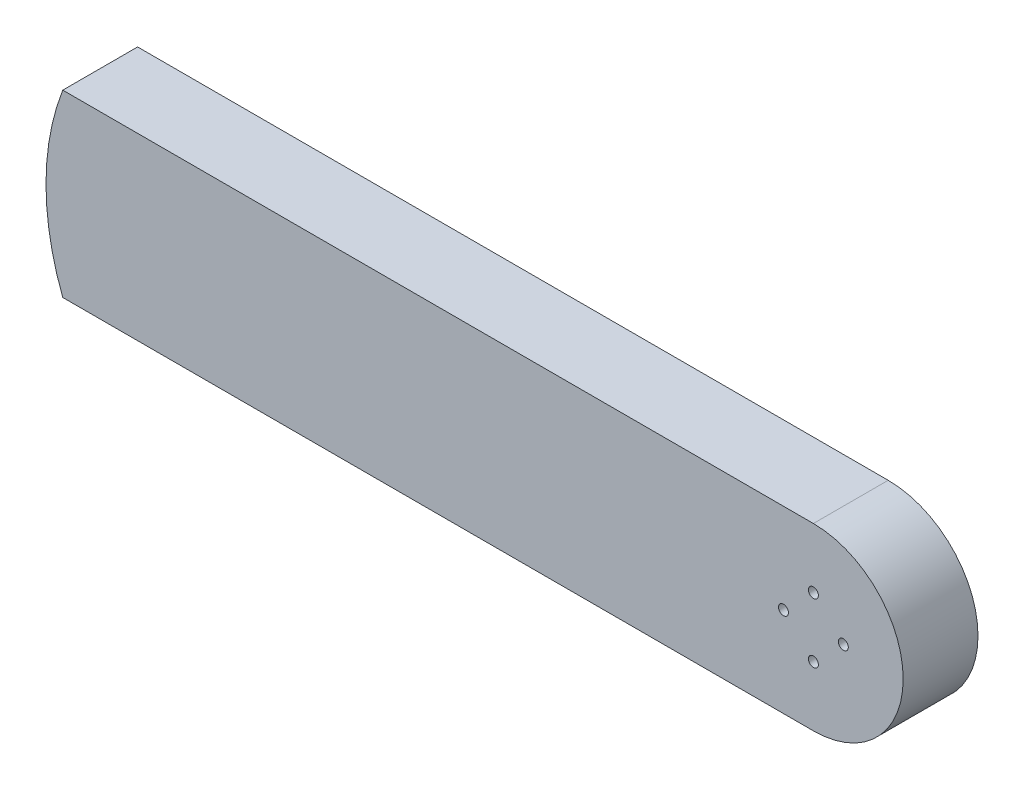
ISO-10303-21;
HEADER;
FILE_DESCRIPTION(('STEP AP214'),'2;1');
FILE_NAME('part.step','',(''),(''),'','','');
FILE_SCHEMA(('AUTOMOTIVE_DESIGN { 1 0 10303 214 1 1 1 1 }'));
ENDSEC;
DATA;
#1=APPLICATION_CONTEXT('core data for automotive mechanical design processes');
#2=APPLICATION_PROTOCOL_DEFINITION('international standard','automotive_design',2000,#1);
#3=PRODUCT_CONTEXT('',#1,'mechanical');
#4=PRODUCT('Part','Part','',(#3));
#5=PRODUCT_RELATED_PRODUCT_CATEGORY('part','',(#4));
#6=PRODUCT_DEFINITION_FORMATION('','',#4);
#7=PRODUCT_DEFINITION_CONTEXT('part definition',#1,'design');
#8=PRODUCT_DEFINITION('design','',#6,#7);
#9=PRODUCT_DEFINITION_SHAPE('','',#8);
#10=(LENGTH_UNIT() NAMED_UNIT(*) SI_UNIT(.MILLI.,.METRE.));
#11=(NAMED_UNIT(*) PLANE_ANGLE_UNIT() SI_UNIT($,.RADIAN.));
#12=(NAMED_UNIT(*) SI_UNIT($,.STERADIAN.) SOLID_ANGLE_UNIT());
#13=UNCERTAINTY_MEASURE_WITH_UNIT(LENGTH_MEASURE(1.E-05),#10,'distance_accuracy_value','');
#14=(GEOMETRIC_REPRESENTATION_CONTEXT(3) GLOBAL_UNCERTAINTY_ASSIGNED_CONTEXT((#13)) GLOBAL_UNIT_ASSIGNED_CONTEXT((#10,
#11,#12)) REPRESENTATION_CONTEXT('',''));
#15=CARTESIAN_POINT('',(0.,0.,0.));
#16=DIRECTION('',(0.,0.,1.));
#17=DIRECTION('',(1.,0.,0.));
#18=AXIS2_PLACEMENT_3D('',#15,#16,#17);
#19=CARTESIAN_POINT('',(0.,0.,15.));
#20=DIRECTION('',(0.,0.,-1.));
#21=DIRECTION('',(-1.,0.,0.));
#22=AXIS2_PLACEMENT_3D('',#19,#20,#21);
#23=PLANE('',#22);
#24=CARTESIAN_POINT('',(153.829678241047,12.,15.));
#25=DIRECTION('',(0.,0.,-1.));
#26=DIRECTION('',(-1.,0.,0.));
#27=AXIS2_PLACEMENT_3D('',#24,#25,#26);
#28=CIRCLE('',#27,0.999999999999998);
#29=CARTESIAN_POINT('',(152.829678241047,12.,15.));
#30=VERTEX_POINT('',#29);
#31=EDGE_CURVE('E298',#30,#30,#28,.T.);
#32=ORIENTED_EDGE('',*,*,#31,.T.);
#33=EDGE_LOOP('',(#32));
#34=FACE_BOUND('',#33,.T.);
#35=CARTESIAN_POINT('',(159.829678241047,18.,15.));
#36=DIRECTION('',(0.,0.,-1.));
#37=DIRECTION('',(-1.,0.,0.));
#38=AXIS2_PLACEMENT_3D('',#35,#36,#37);
#39=CIRCLE('',#38,0.999999999999998);
#40=CARTESIAN_POINT('',(158.829678241047,18.,15.));
#41=VERTEX_POINT('',#40);
#42=EDGE_CURVE('E316',#41,#41,#39,.T.);
#43=ORIENTED_EDGE('',*,*,#42,.T.);
#44=EDGE_LOOP('',(#43));
#45=FACE_BOUND('',#44,.T.);
#46=CARTESIAN_POINT('',(153.829678241047,24.,15.));
#47=DIRECTION('',(0.,0.,-1.));
#48=DIRECTION('',(-1.,0.,0.));
#49=AXIS2_PLACEMENT_3D('',#46,#47,#48);
#50=CIRCLE('',#49,0.999999999999998);
#51=CARTESIAN_POINT('',(152.829678241047,24.,15.));
#52=VERTEX_POINT('',#51);
#53=EDGE_CURVE('E324',#52,#52,#50,.T.);
#54=ORIENTED_EDGE('',*,*,#53,.T.);
#55=EDGE_LOOP('',(#54));
#56=FACE_BOUND('',#55,.T.);
#57=CARTESIAN_POINT('',(147.829678241047,18.,15.));
#58=DIRECTION('',(0.,0.,-1.));
#59=DIRECTION('',(-1.,0.,0.));
#60=AXIS2_PLACEMENT_3D('',#57,#58,#59);
#61=CIRCLE('',#60,0.999999999999998);
#62=CARTESIAN_POINT('',(146.829678241047,18.,15.));
#63=VERTEX_POINT('',#62);
#64=EDGE_CURVE('E303',#63,#63,#61,.T.);
#65=ORIENTED_EDGE('',*,*,#64,.T.);
#66=EDGE_LOOP('',(#65));
#67=FACE_BOUND('',#66,.T.);
#68=CARTESIAN_POINT('',(49.87,18.,15.));
#69=DIRECTION('',(0.,0.,-1.));
#70=DIRECTION('',(-1.,0.,0.));
#71=AXIS2_PLACEMENT_3D('',#68,#69,#70);
#72=CIRCLE('',#71,49.87);
#73=CARTESIAN_POINT('',(3.3617544944985,36.,15.));
#74=VERTEX_POINT('',#73);
#75=CARTESIAN_POINT('',(3.36175449449851,0.,15.));
#76=VERTEX_POINT('',#75);
#77=EDGE_CURVE('E145',#74,#76,#72,.F.);
#78=ORIENTED_EDGE('',*,*,#77,.T.);
#79=DIRECTION('',(1.,0.,0.));
#80=VECTOR('',#79,1.);
#81=CARTESIAN_POINT('',(0.,0.,15.));
#82=LINE('',#81,#80);
#83=CARTESIAN_POINT('',(153.829678241047,0.,15.));
#84=VERTEX_POINT('',#83);
#85=EDGE_CURVE('E72',#76,#84,#82,.T.);
#86=ORIENTED_EDGE('',*,*,#85,.T.);
#87=CARTESIAN_POINT('',(153.829678241047,18.,15.));
#88=DIRECTION('',(0.,0.,1.));
#89=DIRECTION('',(1.,0.,0.));
#90=AXIS2_PLACEMENT_3D('',#87,#88,#89);
#91=CIRCLE('',#90,18.);
#92=CARTESIAN_POINT('',(153.829678241047,36.,15.));
#93=VERTEX_POINT('',#92);
#94=EDGE_CURVE('E294',#84,#93,#91,.T.);
#95=ORIENTED_EDGE('',*,*,#94,.T.);
#96=DIRECTION('',(-1.,0.,0.));
#97=VECTOR('',#96,1.);
#98=CARTESIAN_POINT('',(0.,36.,15.));
#99=LINE('',#98,#97);
#100=EDGE_CURVE('E12',#93,#74,#99,.T.);
#101=ORIENTED_EDGE('',*,*,#100,.T.);
#102=EDGE_LOOP('',(#78,#86,#95,#101));
#103=FACE_BOUND('',#102,.T.);
#104=ADVANCED_FACE('F62',(#34,#45,#56,#67,#103),#23,.F.);
#105=CARTESIAN_POINT('',(0.,0.,0.));
#106=DIRECTION('',(0.,0.,-1.));
#107=DIRECTION('',(-1.,0.,0.));
#108=AXIS2_PLACEMENT_3D('',#105,#106,#107);
#109=PLANE('',#108);
#110=DIRECTION('',(0.,1.,0.));
#111=VECTOR('',#110,1.);
#112=CARTESIAN_POINT('',(145.169424203202,0.,0.));
#113=LINE('',#112,#111);
#114=CARTESIAN_POINT('',(145.169424203202,13.,0.));
#115=VERTEX_POINT('',#114);
#116=CARTESIAN_POINT('',(145.169424203202,23.,0.));
#117=VERTEX_POINT('',#116);
#118=EDGE_CURVE('E90',#115,#117,#113,.T.);
#119=ORIENTED_EDGE('',*,*,#118,.F.);
#120=DIRECTION('',(-0.866025403784439,0.5,0.));
#121=VECTOR('',#120,1.);
#122=CARTESIAN_POINT('',(41.9215211753995,72.6102046063664,0.));
#123=LINE('',#122,#121);
#124=CARTESIAN_POINT('',(153.829678241047,7.99999999999995,0.));
#125=VERTEX_POINT('',#124);
#126=EDGE_CURVE('E215',#125,#115,#123,.T.);
#127=ORIENTED_EDGE('',*,*,#126,.F.);
#128=DIRECTION('',(-0.866025403784439,-0.5,0.));
#129=VECTOR('',#128,1.);
#130=CARTESIAN_POINT('',(34.9933179451239,-60.6102046063664,0.));
#131=LINE('',#130,#129);
#132=CARTESIAN_POINT('',(162.489932278891,13.,0.));
#133=VERTEX_POINT('',#132);
#134=EDGE_CURVE('E244',#133,#125,#131,.T.);
#135=ORIENTED_EDGE('',*,*,#134,.F.);
#136=DIRECTION('',(0.,-1.,0.));
#137=VECTOR('',#136,1.);
#138=CARTESIAN_POINT('',(162.489932278891,0.,0.));
#139=LINE('',#138,#137);
#140=CARTESIAN_POINT('',(162.489932278891,23.,0.));
#141=VERTEX_POINT('',#140);
#142=EDGE_CURVE('E243',#141,#133,#139,.T.);
#143=ORIENTED_EDGE('',*,*,#142,.F.);
#144=DIRECTION('',(0.866025403784438,-0.5,0.));
#145=VECTOR('',#144,1.);
#146=CARTESIAN_POINT('',(50.5817752132439,87.6102046063665,0.));
#147=LINE('',#146,#145);
#148=CARTESIAN_POINT('',(153.829678241047,28.,0.));
#149=VERTEX_POINT('',#148);
#150=EDGE_CURVE('E241',#149,#141,#147,.T.);
#151=ORIENTED_EDGE('',*,*,#150,.F.);
#152=DIRECTION('',(0.866025403784439,0.499999999999999,0.));
#153=VECTOR('',#152,1.);
#154=CARTESIAN_POINT('',(26.3330639072794,-45.6102046063663,0.));
#155=LINE('',#154,#153);
#156=EDGE_CURVE('E238',#117,#149,#155,.T.);
#157=ORIENTED_EDGE('',*,*,#156,.F.);
#158=EDGE_LOOP('',(#119,#127,#135,#143,#151,#157));
#159=FACE_BOUND('',#158,.T.);
#160=CARTESIAN_POINT('',(7.,18.,0.));
#161=DIRECTION('',(0.,0.,1.));
#162=DIRECTION('',(1.,0.,0.));
#163=AXIS2_PLACEMENT_3D('',#160,#161,#162);
#164=CIRCLE('',#163,0.999999999999983);
#165=CARTESIAN_POINT('',(7.99999999999998,18.,0.));
#166=VERTEX_POINT('',#165);
#167=EDGE_CURVE('E165',#166,#166,#164,.F.);
#168=ORIENTED_EDGE('',*,*,#167,.F.);
#169=EDGE_LOOP('',(#168));
#170=FACE_BOUND('',#169,.T.);
#171=CARTESIAN_POINT('',(90.7214002208002,5.,0.));
#172=DIRECTION('',(0.,0.,-1.));
#173=DIRECTION('',(-1.,0.,0.));
#174=AXIS2_PLACEMENT_3D('',#171,#172,#173);
#175=CIRCLE('',#174,0.999999999999998);
#176=CARTESIAN_POINT('',(89.7214002208002,5.,0.));
#177=VERTEX_POINT('',#176);
#178=EDGE_CURVE('E185',#177,#177,#175,.T.);
#179=ORIENTED_EDGE('',*,*,#178,.F.);
#180=EDGE_LOOP('',(#179));
#181=FACE_BOUND('',#180,.T.);
#182=CARTESIAN_POINT('',(9.01859977919973,31.,0.));
#183=DIRECTION('',(0.,0.,-1.));
#184=DIRECTION('',(-1.,0.,0.));
#185=AXIS2_PLACEMENT_3D('',#182,#183,#184);
#186=CIRCLE('',#185,0.999999999999998);
#187=CARTESIAN_POINT('',(8.01859977919974,31.,0.));
#188=VERTEX_POINT('',#187);
#189=EDGE_CURVE('E174',#188,#188,#186,.T.);
#190=ORIENTED_EDGE('',*,*,#189,.F.);
#191=EDGE_LOOP('',(#190));
#192=FACE_BOUND('',#191,.T.);
#193=CARTESIAN_POINT('',(9.01859977919973,5.00000000000001,0.));
#194=DIRECTION('',(0.,0.,1.));
#195=DIRECTION('',(1.,0.,0.));
#196=AXIS2_PLACEMENT_3D('',#193,#194,#195);
#197=CIRCLE('',#196,0.999999999999998);
#198=CARTESIAN_POINT('',(10.0185997791997,5.00000000000001,0.));
#199=VERTEX_POINT('',#198);
#200=EDGE_CURVE('E193',#199,#199,#197,.F.);
#201=ORIENTED_EDGE('',*,*,#200,.F.);
#202=EDGE_LOOP('',(#201));
#203=FACE_BOUND('',#202,.T.);
#204=CARTESIAN_POINT('',(90.7214002208003,31.,0.));
#205=DIRECTION('',(0.,0.,1.));
#206=DIRECTION('',(1.,0.,0.));
#207=AXIS2_PLACEMENT_3D('',#204,#205,#206);
#208=CIRCLE('',#207,0.999999999999998);
#209=CARTESIAN_POINT('',(91.7214002208003,31.,0.));
#210=VERTEX_POINT('',#209);
#211=EDGE_CURVE('E169',#210,#210,#208,.F.);
#212=ORIENTED_EDGE('',*,*,#211,.F.);
#213=EDGE_LOOP('',(#212));
#214=FACE_BOUND('',#213,.T.);
#215=CARTESIAN_POINT('',(92.74,18.,0.));
#216=DIRECTION('',(0.,0.,-1.));
#217=DIRECTION('',(-1.,0.,0.));
#218=AXIS2_PLACEMENT_3D('',#215,#216,#217);
#219=CIRCLE('',#218,0.999999999999998);
#220=CARTESIAN_POINT('',(91.74,18.,0.));
#221=VERTEX_POINT('',#220);
#222=EDGE_CURVE('E189',#221,#221,#219,.T.);
#223=ORIENTED_EDGE('',*,*,#222,.F.);
#224=EDGE_LOOP('',(#223));
#225=FACE_BOUND('',#224,.T.);
#226=DIRECTION('',(1.,0.,0.));
#227=VECTOR('',#226,1.);
#228=CARTESIAN_POINT('',(0.,0.,0.));
#229=LINE('',#228,#227);
#230=CARTESIAN_POINT('',(3.36175449449851,0.,0.));
#231=VERTEX_POINT('',#230);
#232=CARTESIAN_POINT('',(153.829678241047,0.,0.));
#233=VERTEX_POINT('',#232);
#234=EDGE_CURVE('E78',#231,#233,#229,.T.);
#235=ORIENTED_EDGE('',*,*,#234,.F.);
#236=CARTESIAN_POINT('',(49.87,18.,0.));
#237=DIRECTION('',(0.,0.,-1.));
#238=DIRECTION('',(-1.,0.,0.));
#239=AXIS2_PLACEMENT_3D('',#236,#237,#238);
#240=CIRCLE('',#239,49.87);
#241=CARTESIAN_POINT('',(3.3617544944985,36.,0.));
#242=VERTEX_POINT('',#241);
#243=EDGE_CURVE('E149',#231,#242,#240,.T.);
#244=ORIENTED_EDGE('',*,*,#243,.T.);
#245=DIRECTION('',(-1.,0.,0.));
#246=VECTOR('',#245,1.);
#247=CARTESIAN_POINT('',(0.,36.,0.));
#248=LINE('',#247,#246);
#249=CARTESIAN_POINT('',(153.829678241047,36.,0.));
#250=VERTEX_POINT('',#249);
#251=EDGE_CURVE('E66',#250,#242,#248,.T.);
#252=ORIENTED_EDGE('',*,*,#251,.F.);
#253=CARTESIAN_POINT('',(153.829678241047,18.,0.));
#254=DIRECTION('',(0.,0.,-1.));
#255=DIRECTION('',(-1.,0.,0.));
#256=AXIS2_PLACEMENT_3D('',#253,#254,#255);
#257=CIRCLE('',#256,18.);
#258=EDGE_CURVE('E292',#233,#250,#257,.F.);
#259=ORIENTED_EDGE('',*,*,#258,.F.);
#260=EDGE_LOOP('',(#235,#244,#252,#259));
#261=FACE_BOUND('',#260,.T.);
#262=ADVANCED_FACE('F273',(#159,#170,#181,#192,#203,#214,#225,#261),#109,.T.);
#263=CARTESIAN_POINT('',(0.,0.,15.));
#264=DIRECTION('',(0.,1.,0.));
#265=DIRECTION('',(0.,0.,1.));
#266=AXIS2_PLACEMENT_3D('',#263,#264,#265);
#267=PLANE('',#266);
#268=DIRECTION('',(0.,0.,-1.));
#269=VECTOR('',#268,1.);
#270=CARTESIAN_POINT('',(3.36175449449851,0.,15.001));
#271=LINE('',#270,#269);
#272=EDGE_CURVE('E154',#76,#231,#271,.T.);
#273=ORIENTED_EDGE('',*,*,#272,.T.);
#274=ORIENTED_EDGE('',*,*,#234,.T.);
#275=DIRECTION('',(0.,0.,1.));
#276=VECTOR('',#275,1.);
#277=CARTESIAN_POINT('',(153.829678241047,0.,-0.000999999999999265));
#278=LINE('',#277,#276);
#279=EDGE_CURVE('E156',#233,#84,#278,.T.);
#280=ORIENTED_EDGE('',*,*,#279,.T.);
#281=ORIENTED_EDGE('',*,*,#85,.F.);
#282=EDGE_LOOP('',(#273,#274,#280,#281));
#283=FACE_BOUND('',#282,.T.);
#284=ADVANCED_FACE('F64',(#283),#267,.F.);
#285=CARTESIAN_POINT('',(0.,36.,15.));
#286=DIRECTION('',(0.,-1.,0.));
#287=DIRECTION('',(0.,0.,-1.));
#288=AXIS2_PLACEMENT_3D('',#285,#286,#287);
#289=PLANE('',#288);
#290=DIRECTION('',(0.,0.,-1.));
#291=VECTOR('',#290,1.);
#292=CARTESIAN_POINT('',(3.3617544944985,36.,15.001));
#293=LINE('',#292,#291);
#294=EDGE_CURVE('E308',#74,#242,#293,.T.);
#295=ORIENTED_EDGE('',*,*,#294,.F.);
#296=ORIENTED_EDGE('',*,*,#100,.F.);
#297=DIRECTION('',(0.,0.,1.));
#298=VECTOR('',#297,1.);
#299=CARTESIAN_POINT('',(153.829678241047,36.,-0.000999999999999265));
#300=LINE('',#299,#298);
#301=EDGE_CURVE('E237',#250,#93,#300,.T.);
#302=ORIENTED_EDGE('',*,*,#301,.F.);
#303=ORIENTED_EDGE('',*,*,#251,.T.);
#304=EDGE_LOOP('',(#295,#296,#302,#303));
#305=FACE_BOUND('',#304,.T.);
#306=ADVANCED_FACE('F310',(#305),#289,.F.);
#307=CARTESIAN_POINT('',(92.74,18.,5.));
#308=DIRECTION('',(0.,0.,-1.));
#309=DIRECTION('',(-1.,0.,0.));
#310=AXIS2_PLACEMENT_3D('',#307,#308,#309);
#311=CYLINDRICAL_SURFACE('',#310,0.999999999999998);
#312=CARTESIAN_POINT('',(92.74,18.,5.));
#313=DIRECTION('',(0.,0.,-1.));
#314=DIRECTION('',(-1.,0.,0.));
#315=AXIS2_PLACEMENT_3D('',#312,#313,#314);
#316=CIRCLE('',#315,0.999999999999998);
#317=CARTESIAN_POINT('',(91.74,18.,5.));
#318=VERTEX_POINT('',#317);
#319=EDGE_CURVE('E160',#318,#318,#316,.T.);
#320=ORIENTED_EDGE('',*,*,#319,.F.);
#321=EDGE_LOOP('',(#320));
#322=FACE_BOUND('',#321,.T.);
#323=ORIENTED_EDGE('',*,*,#222,.T.);
#324=EDGE_LOOP('',(#323));
#325=FACE_BOUND('',#324,.T.);
#326=ADVANCED_FACE('F358',(#322,#325),#311,.F.);
#327=CARTESIAN_POINT('',(92.74,18.,5.));
#328=DIRECTION('',(0.,0.,-1.));
#329=DIRECTION('',(-1.,0.,0.));
#330=AXIS2_PLACEMENT_3D('',#327,#328,#329);
#331=PLANE('',#330);
#332=ORIENTED_EDGE('',*,*,#319,.T.);
#333=EDGE_LOOP('',(#332));
#334=FACE_BOUND('',#333,.T.);
#335=ADVANCED_FACE('F354',(#334),#331,.T.);
#336=CARTESIAN_POINT('',(90.7214002208003,31.,5.));
#337=DIRECTION('',(0.,0.,-1.));
#338=DIRECTION('',(-1.,0.,0.));
#339=AXIS2_PLACEMENT_3D('',#336,#337,#338);
#340=CYLINDRICAL_SURFACE('',#339,0.999999999999998);
#341=CARTESIAN_POINT('',(90.7214002208003,31.,5.));
#342=DIRECTION('',(0.,0.,1.));
#343=DIRECTION('',(1.,0.,0.));
#344=AXIS2_PLACEMENT_3D('',#341,#342,#343);
#345=CIRCLE('',#344,0.999999999999998);
#346=CARTESIAN_POINT('',(91.7214002208003,31.,5.));
#347=VERTEX_POINT('',#346);
#348=EDGE_CURVE('E191',#347,#347,#345,.F.);
#349=ORIENTED_EDGE('',*,*,#348,.F.);
#350=EDGE_LOOP('',(#349));
#351=FACE_BOUND('',#350,.T.);
#352=ORIENTED_EDGE('',*,*,#211,.T.);
#353=EDGE_LOOP('',(#352));
#354=FACE_BOUND('',#353,.T.);
#355=ADVANCED_FACE('F556',(#351,#354),#340,.F.);
#356=CARTESIAN_POINT('',(0.,0.,5.));
#357=DIRECTION('',(0.,0.,1.));
#358=DIRECTION('',(1.,0.,0.));
#359=AXIS2_PLACEMENT_3D('',#356,#357,#358);
#360=PLANE('',#359);
#361=ORIENTED_EDGE('',*,*,#348,.T.);
#362=EDGE_LOOP('',(#361));
#363=FACE_BOUND('',#362,.T.);
#364=ADVANCED_FACE('F548',(#363),#360,.F.);
#365=CARTESIAN_POINT('',(9.01859977919973,5.00000000000001,5.));
#366=DIRECTION('',(0.,0.,-1.));
#367=DIRECTION('',(-1.,0.,0.));
#368=AXIS2_PLACEMENT_3D('',#365,#366,#367);
#369=CYLINDRICAL_SURFACE('',#368,0.999999999999998);
#370=CARTESIAN_POINT('',(9.01859977919973,5.00000000000001,5.));
#371=DIRECTION('',(0.,0.,1.));
#372=DIRECTION('',(1.,0.,0.));
#373=AXIS2_PLACEMENT_3D('',#370,#371,#372);
#374=CIRCLE('',#373,0.999999999999998);
#375=CARTESIAN_POINT('',(10.0185997791997,5.00000000000001,5.));
#376=VERTEX_POINT('',#375);
#377=EDGE_CURVE('E178',#376,#376,#374,.F.);
#378=ORIENTED_EDGE('',*,*,#377,.F.);
#379=EDGE_LOOP('',(#378));
#380=FACE_BOUND('',#379,.T.);
#381=ORIENTED_EDGE('',*,*,#200,.T.);
#382=EDGE_LOOP('',(#381));
#383=FACE_BOUND('',#382,.T.);
#384=ADVANCED_FACE('F539',(#380,#383),#369,.F.);
#385=CARTESIAN_POINT('',(0.,0.,5.));
#386=DIRECTION('',(0.,0.,1.));
#387=DIRECTION('',(1.,0.,0.));
#388=AXIS2_PLACEMENT_3D('',#385,#386,#387);
#389=PLANE('',#388);
#390=ORIENTED_EDGE('',*,*,#377,.T.);
#391=EDGE_LOOP('',(#390));
#392=FACE_BOUND('',#391,.T.);
#393=ADVANCED_FACE('F530',(#392),#389,.F.);
#394=CARTESIAN_POINT('',(9.01859977919973,31.,5.));
#395=DIRECTION('',(0.,0.,-1.));
#396=DIRECTION('',(-1.,0.,0.));
#397=AXIS2_PLACEMENT_3D('',#394,#395,#396);
#398=CYLINDRICAL_SURFACE('',#397,0.999999999999998);
#399=CARTESIAN_POINT('',(9.01859977919973,31.,5.));
#400=DIRECTION('',(0.,0.,-1.));
#401=DIRECTION('',(-1.,0.,0.));
#402=AXIS2_PLACEMENT_3D('',#399,#400,#401);
#403=CIRCLE('',#402,0.999999999999998);
#404=CARTESIAN_POINT('',(8.01859977919974,31.,5.));
#405=VERTEX_POINT('',#404);
#406=EDGE_CURVE('E177',#405,#405,#403,.T.);
#407=ORIENTED_EDGE('',*,*,#406,.F.);
#408=EDGE_LOOP('',(#407));
#409=FACE_BOUND('',#408,.T.);
#410=ORIENTED_EDGE('',*,*,#189,.T.);
#411=EDGE_LOOP('',(#410));
#412=FACE_BOUND('',#411,.T.);
#413=ADVANCED_FACE('F524',(#409,#412),#398,.F.);
#414=CARTESIAN_POINT('',(9.01859977919973,31.,5.));
#415=DIRECTION('',(0.,0.,-1.));
#416=DIRECTION('',(-1.,0.,0.));
#417=AXIS2_PLACEMENT_3D('',#414,#415,#416);
#418=PLANE('',#417);
#419=ORIENTED_EDGE('',*,*,#406,.T.);
#420=EDGE_LOOP('',(#419));
#421=FACE_BOUND('',#420,.T.);
#422=ADVANCED_FACE('F515',(#421),#418,.T.);
#423=CARTESIAN_POINT('',(90.7214002208002,5.,5.));
#424=DIRECTION('',(0.,0.,-1.));
#425=DIRECTION('',(-1.,0.,0.));
#426=AXIS2_PLACEMENT_3D('',#423,#424,#425);
#427=CYLINDRICAL_SURFACE('',#426,0.999999999999998);
#428=CARTESIAN_POINT('',(90.7214002208002,5.,5.));
#429=DIRECTION('',(0.,0.,-1.));
#430=DIRECTION('',(-1.,0.,0.));
#431=AXIS2_PLACEMENT_3D('',#428,#429,#430);
#432=CIRCLE('',#431,0.999999999999998);
#433=CARTESIAN_POINT('',(89.7214002208002,5.,5.));
#434=VERTEX_POINT('',#433);
#435=EDGE_CURVE('E184',#434,#434,#432,.T.);
#436=ORIENTED_EDGE('',*,*,#435,.F.);
#437=EDGE_LOOP('',(#436));
#438=FACE_BOUND('',#437,.T.);
#439=ORIENTED_EDGE('',*,*,#178,.T.);
#440=EDGE_LOOP('',(#439));
#441=FACE_BOUND('',#440,.T.);
#442=ADVANCED_FACE('F503',(#438,#441),#427,.F.);
#443=CARTESIAN_POINT('',(90.7214002208002,5.,5.));
#444=DIRECTION('',(0.,0.,-1.));
#445=DIRECTION('',(-1.,0.,0.));
#446=AXIS2_PLACEMENT_3D('',#443,#444,#445);
#447=PLANE('',#446);
#448=ORIENTED_EDGE('',*,*,#435,.T.);
#449=EDGE_LOOP('',(#448));
#450=FACE_BOUND('',#449,.T.);
#451=ADVANCED_FACE('F494',(#450),#447,.T.);
#452=CARTESIAN_POINT('',(7.,18.,5.));
#453=DIRECTION('',(0.,0.,-1.));
#454=DIRECTION('',(-1.,0.,0.));
#455=AXIS2_PLACEMENT_3D('',#452,#453,#454);
#456=CYLINDRICAL_SURFACE('',#455,0.999999999999983);
#457=CARTESIAN_POINT('',(7.,18.,5.));
#458=DIRECTION('',(0.,0.,1.));
#459=DIRECTION('',(1.,0.,0.));
#460=AXIS2_PLACEMENT_3D('',#457,#458,#459);
#461=CIRCLE('',#460,0.999999999999983);
#462=CARTESIAN_POINT('',(7.99999999999998,18.,5.));
#463=VERTEX_POINT('',#462);
#464=EDGE_CURVE('E162',#463,#463,#461,.F.);
#465=ORIENTED_EDGE('',*,*,#464,.F.);
#466=EDGE_LOOP('',(#465));
#467=FACE_BOUND('',#466,.T.);
#468=ORIENTED_EDGE('',*,*,#167,.T.);
#469=EDGE_LOOP('',(#468));
#470=FACE_BOUND('',#469,.T.);
#471=ADVANCED_FACE('F488',(#467,#470),#456,.F.);
#472=CARTESIAN_POINT('',(0.,0.,5.));
#473=DIRECTION('',(0.,0.,1.));
#474=DIRECTION('',(1.,0.,0.));
#475=AXIS2_PLACEMENT_3D('',#472,#473,#474);
#476=PLANE('',#475);
#477=ORIENTED_EDGE('',*,*,#464,.T.);
#478=EDGE_LOOP('',(#477));
#479=FACE_BOUND('',#478,.T.);
#480=ADVANCED_FACE('F480',(#479),#476,.F.);
#481=CARTESIAN_POINT('',(145.169424203202,0.,10.));
#482=DIRECTION('',(-1.,0.,0.));
#483=DIRECTION('',(0.,0.,1.));
#484=AXIS2_PLACEMENT_3D('',#481,#482,#483);
#485=PLANE('',#484);
#486=ORIENTED_EDGE('',*,*,#118,.T.);
#487=DIRECTION('',(0.,0.,-1.));
#488=VECTOR('',#487,1.);
#489=CARTESIAN_POINT('',(145.169424203202,23.,10.));
#490=LINE('',#489,#488);
#491=CARTESIAN_POINT('',(145.169424203202,23.,10.));
#492=VERTEX_POINT('',#491);
#493=EDGE_CURVE('E175',#492,#117,#490,.T.);
#494=ORIENTED_EDGE('',*,*,#493,.F.);
#495=DIRECTION('',(0.,1.,0.));
#496=VECTOR('',#495,1.);
#497=CARTESIAN_POINT('',(145.169424203202,0.,10.));
#498=LINE('',#497,#496);
#499=CARTESIAN_POINT('',(145.169424203202,13.,10.));
#500=VERTEX_POINT('',#499);
#501=EDGE_CURVE('E249',#500,#492,#498,.T.);
#502=ORIENTED_EDGE('',*,*,#501,.F.);
#503=DIRECTION('',(0.,0.,-1.));
#504=VECTOR('',#503,1.);
#505=CARTESIAN_POINT('',(145.169424203202,13.,10.));
#506=LINE('',#505,#504);
#507=EDGE_CURVE('E202',#500,#115,#506,.T.);
#508=ORIENTED_EDGE('',*,*,#507,.T.);
#509=EDGE_LOOP('',(#486,#494,#502,#508));
#510=FACE_BOUND('',#509,.T.);
#511=ADVANCED_FACE('F270',(#510),#485,.F.);
#512=CARTESIAN_POINT('',(41.9215211753995,72.6102046063664,10.));
#513=DIRECTION('',(-0.5,-0.866025403784438,0.));
#514=DIRECTION('',(0.866025403784438,-0.5,0.));
#515=AXIS2_PLACEMENT_3D('',#512,#513,#514);
#516=PLANE('',#515);
#517=ORIENTED_EDGE('',*,*,#126,.T.);
#518=ORIENTED_EDGE('',*,*,#507,.F.);
#519=DIRECTION('',(-0.866025403784439,0.5,0.));
#520=VECTOR('',#519,1.);
#521=CARTESIAN_POINT('',(41.9215211753995,72.6102046063664,10.));
#522=LINE('',#521,#520);
#523=CARTESIAN_POINT('',(153.829678241047,7.99999999999995,10.));
#524=VERTEX_POINT('',#523);
#525=EDGE_CURVE('E222',#524,#500,#522,.T.);
#526=ORIENTED_EDGE('',*,*,#525,.F.);
#527=DIRECTION('',(0.,0.,-1.));
#528=VECTOR('',#527,1.);
#529=CARTESIAN_POINT('',(153.829678241047,7.99999999999995,10.));
#530=LINE('',#529,#528);
#531=EDGE_CURVE('E205',#524,#125,#530,.T.);
#532=ORIENTED_EDGE('',*,*,#531,.T.);
#533=EDGE_LOOP('',(#517,#518,#526,#532));
#534=FACE_BOUND('',#533,.T.);
#535=ADVANCED_FACE('F268',(#534),#516,.F.);
#536=CARTESIAN_POINT('',(34.9933179451239,-60.6102046063664,10.));
#537=DIRECTION('',(0.5,-0.866025403784439,0.));
#538=DIRECTION('',(0.866025403784439,0.5,0.));
#539=AXIS2_PLACEMENT_3D('',#536,#537,#538);
#540=PLANE('',#539);
#541=ORIENTED_EDGE('',*,*,#134,.T.);
#542=ORIENTED_EDGE('',*,*,#531,.F.);
#543=DIRECTION('',(-0.866025403784439,-0.5,0.));
#544=VECTOR('',#543,1.);
#545=CARTESIAN_POINT('',(34.9933179451239,-60.6102046063664,10.));
#546=LINE('',#545,#544);
#547=CARTESIAN_POINT('',(162.489932278891,13.,10.));
#548=VERTEX_POINT('',#547);
#549=EDGE_CURVE('E227',#548,#524,#546,.T.);
#550=ORIENTED_EDGE('',*,*,#549,.F.);
#551=DIRECTION('',(0.,0.,-1.));
#552=VECTOR('',#551,1.);
#553=CARTESIAN_POINT('',(162.489932278891,13.,10.));
#554=LINE('',#553,#552);
#555=EDGE_CURVE('E209',#548,#133,#554,.T.);
#556=ORIENTED_EDGE('',*,*,#555,.T.);
#557=EDGE_LOOP('',(#541,#542,#550,#556));
#558=FACE_BOUND('',#557,.T.);
#559=ADVANCED_FACE('F269',(#558),#540,.F.);
#560=CARTESIAN_POINT('',(162.489932278891,0.,10.));
#561=DIRECTION('',(1.,0.,0.));
#562=DIRECTION('',(0.,0.,-1.));
#563=AXIS2_PLACEMENT_3D('',#560,#561,#562);
#564=PLANE('',#563);
#565=ORIENTED_EDGE('',*,*,#142,.T.);
#566=ORIENTED_EDGE('',*,*,#555,.F.);
#567=DIRECTION('',(0.,-1.,0.));
#568=VECTOR('',#567,1.);
#569=CARTESIAN_POINT('',(162.489932278891,0.,10.));
#570=LINE('',#569,#568);
#571=CARTESIAN_POINT('',(162.489932278891,23.,10.));
#572=VERTEX_POINT('',#571);
#573=EDGE_CURVE('E231',#572,#548,#570,.T.);
#574=ORIENTED_EDGE('',*,*,#573,.F.);
#575=DIRECTION('',(0.,0.,-1.));
#576=VECTOR('',#575,1.);
#577=CARTESIAN_POINT('',(162.489932278891,23.,10.));
#578=LINE('',#577,#576);
#579=EDGE_CURVE('E219',#572,#141,#578,.T.);
#580=ORIENTED_EDGE('',*,*,#579,.T.);
#581=EDGE_LOOP('',(#565,#566,#574,#580));
#582=FACE_BOUND('',#581,.T.);
#583=ADVANCED_FACE('F266',(#582),#564,.F.);
#584=CARTESIAN_POINT('',(50.5817752132439,87.6102046063665,10.));
#585=DIRECTION('',(0.5,0.866025403784438,0.));
#586=DIRECTION('',(-0.866025403784438,0.5,0.));
#587=AXIS2_PLACEMENT_3D('',#584,#585,#586);
#588=PLANE('',#587);
#589=ORIENTED_EDGE('',*,*,#150,.T.);
#590=ORIENTED_EDGE('',*,*,#579,.F.);
#591=DIRECTION('',(0.866025403784438,-0.5,0.));
#592=VECTOR('',#591,1.);
#593=CARTESIAN_POINT('',(50.5817752132439,87.6102046063665,10.));
#594=LINE('',#593,#592);
#595=CARTESIAN_POINT('',(153.829678241047,28.,10.));
#596=VERTEX_POINT('',#595);
#597=EDGE_CURVE('E253',#596,#572,#594,.T.);
#598=ORIENTED_EDGE('',*,*,#597,.F.);
#599=DIRECTION('',(0.,0.,-1.));
#600=VECTOR('',#599,1.);
#601=CARTESIAN_POINT('',(153.829678241047,28.,10.));
#602=LINE('',#601,#600);
#603=EDGE_CURVE('E216',#596,#149,#602,.T.);
#604=ORIENTED_EDGE('',*,*,#603,.T.);
#605=EDGE_LOOP('',(#589,#590,#598,#604));
#606=FACE_BOUND('',#605,.T.);
#607=ADVANCED_FACE('F271',(#606),#588,.F.);
#608=CARTESIAN_POINT('',(26.3330639072794,-45.6102046063663,10.));
#609=DIRECTION('',(-0.499999999999999,0.866025403784439,0.));
#610=DIRECTION('',(-0.866025403784439,-0.499999999999999,0.));
#611=AXIS2_PLACEMENT_3D('',#608,#609,#610);
#612=PLANE('',#611);
#613=ORIENTED_EDGE('',*,*,#156,.T.);
#614=ORIENTED_EDGE('',*,*,#603,.F.);
#615=DIRECTION('',(0.866025403784439,0.499999999999999,0.));
#616=VECTOR('',#615,1.);
#617=CARTESIAN_POINT('',(26.3330639072794,-45.6102046063663,10.));
#618=LINE('',#617,#616);
#619=EDGE_CURVE('E255',#492,#596,#618,.T.);
#620=ORIENTED_EDGE('',*,*,#619,.F.);
#621=ORIENTED_EDGE('',*,*,#493,.T.);
#622=EDGE_LOOP('',(#613,#614,#620,#621));
#623=FACE_BOUND('',#622,.T.);
#624=ADVANCED_FACE('F272',(#623),#612,.F.);
#625=CARTESIAN_POINT('',(0.,0.,10.));
#626=DIRECTION('',(0.,0.,-1.));
#627=DIRECTION('',(-1.,0.,0.));
#628=AXIS2_PLACEMENT_3D('',#625,#626,#627);
#629=PLANE('',#628);
#630=CARTESIAN_POINT('',(153.829678241047,12.,10.));
#631=DIRECTION('',(0.,0.,-1.));
#632=DIRECTION('',(-1.,0.,0.));
#633=AXIS2_PLACEMENT_3D('',#630,#631,#632);
#634=CIRCLE('',#633,0.999999999999998);
#635=CARTESIAN_POINT('',(152.829678241047,12.,10.));
#636=VERTEX_POINT('',#635);
#637=EDGE_CURVE('E297',#636,#636,#634,.T.);
#638=ORIENTED_EDGE('',*,*,#637,.F.);
#639=EDGE_LOOP('',(#638));
#640=FACE_BOUND('',#639,.T.);
#641=CARTESIAN_POINT('',(159.829678241047,18.,10.));
#642=DIRECTION('',(0.,0.,-1.));
#643=DIRECTION('',(-1.,0.,0.));
#644=AXIS2_PLACEMENT_3D('',#641,#642,#643);
#645=CIRCLE('',#644,0.999999999999998);
#646=CARTESIAN_POINT('',(158.829678241047,18.,10.));
#647=VERTEX_POINT('',#646);
#648=EDGE_CURVE('E317',#647,#647,#645,.T.);
#649=ORIENTED_EDGE('',*,*,#648,.F.);
#650=EDGE_LOOP('',(#649));
#651=FACE_BOUND('',#650,.T.);
#652=CARTESIAN_POINT('',(153.829678241047,24.,10.));
#653=DIRECTION('',(0.,0.,-1.));
#654=DIRECTION('',(-1.,0.,0.));
#655=AXIS2_PLACEMENT_3D('',#652,#653,#654);
#656=CIRCLE('',#655,0.999999999999998);
#657=CARTESIAN_POINT('',(152.829678241047,24.,10.));
#658=VERTEX_POINT('',#657);
#659=EDGE_CURVE('E325',#658,#658,#656,.T.);
#660=ORIENTED_EDGE('',*,*,#659,.F.);
#661=EDGE_LOOP('',(#660));
#662=FACE_BOUND('',#661,.T.);
#663=CARTESIAN_POINT('',(147.829678241047,18.,10.));
#664=DIRECTION('',(0.,0.,-1.));
#665=DIRECTION('',(-1.,0.,0.));
#666=AXIS2_PLACEMENT_3D('',#663,#664,#665);
#667=CIRCLE('',#666,0.999999999999998);
#668=CARTESIAN_POINT('',(146.829678241047,18.,10.));
#669=VERTEX_POINT('',#668);
#670=EDGE_CURVE('E311',#669,#669,#667,.T.);
#671=ORIENTED_EDGE('',*,*,#670,.F.);
#672=EDGE_LOOP('',(#671));
#673=FACE_BOUND('',#672,.T.);
#674=ORIENTED_EDGE('',*,*,#501,.T.);
#675=ORIENTED_EDGE('',*,*,#619,.T.);
#676=ORIENTED_EDGE('',*,*,#597,.T.);
#677=ORIENTED_EDGE('',*,*,#573,.T.);
#678=ORIENTED_EDGE('',*,*,#549,.T.);
#679=ORIENTED_EDGE('',*,*,#525,.T.);
#680=EDGE_LOOP('',(#674,#675,#676,#677,#678,#679));
#681=FACE_BOUND('',#680,.T.);
#682=ADVANCED_FACE('F265',(#640,#651,#662,#673,#681),#629,.T.);
#683=CARTESIAN_POINT('',(153.829678241047,18.,-0.000999999999999265));
#684=DIRECTION('',(0.,0.,1.));
#685=DIRECTION('',(1.,0.,0.));
#686=AXIS2_PLACEMENT_3D('',#683,#684,#685);
#687=CYLINDRICAL_SURFACE('',#686,18.);
#688=ORIENTED_EDGE('',*,*,#258,.T.);
#689=ORIENTED_EDGE('',*,*,#301,.T.);
#690=ORIENTED_EDGE('',*,*,#94,.F.);
#691=ORIENTED_EDGE('',*,*,#279,.F.);
#692=EDGE_LOOP('',(#688,#689,#690,#691));
#693=FACE_BOUND('',#692,.T.);
#694=ADVANCED_FACE('F304',(#693),#687,.T.);
#695=CARTESIAN_POINT('',(147.829678241047,18.,15.));
#696=DIRECTION('',(0.,0.,-1.));
#697=DIRECTION('',(-1.,0.,0.));
#698=AXIS2_PLACEMENT_3D('',#695,#696,#697);
#699=CYLINDRICAL_SURFACE('',#698,0.999999999999998);
#700=ORIENTED_EDGE('',*,*,#64,.F.);
#701=EDGE_LOOP('',(#700));
#702=FACE_BOUND('',#701,.T.);
#703=ORIENTED_EDGE('',*,*,#670,.T.);
#704=EDGE_LOOP('',(#703));
#705=FACE_BOUND('',#704,.T.);
#706=ADVANCED_FACE('F327',(#702,#705),#699,.F.);
#707=CARTESIAN_POINT('',(153.829678241047,24.,15.));
#708=DIRECTION('',(0.,0.,-1.));
#709=DIRECTION('',(-1.,0.,0.));
#710=AXIS2_PLACEMENT_3D('',#707,#708,#709);
#711=CYLINDRICAL_SURFACE('',#710,0.999999999999998);
#712=ORIENTED_EDGE('',*,*,#53,.F.);
#713=EDGE_LOOP('',(#712));
#714=FACE_BOUND('',#713,.T.);
#715=ORIENTED_EDGE('',*,*,#659,.T.);
#716=EDGE_LOOP('',(#715));
#717=FACE_BOUND('',#716,.T.);
#718=ADVANCED_FACE('F392',(#714,#717),#711,.F.);
#719=CARTESIAN_POINT('',(159.829678241047,18.,15.));
#720=DIRECTION('',(0.,0.,-1.));
#721=DIRECTION('',(-1.,0.,0.));
#722=AXIS2_PLACEMENT_3D('',#719,#720,#721);
#723=CYLINDRICAL_SURFACE('',#722,0.999999999999998);
#724=ORIENTED_EDGE('',*,*,#42,.F.);
#725=EDGE_LOOP('',(#724));
#726=FACE_BOUND('',#725,.T.);
#727=ORIENTED_EDGE('',*,*,#648,.T.);
#728=EDGE_LOOP('',(#727));
#729=FACE_BOUND('',#728,.T.);
#730=ADVANCED_FACE('F388',(#726,#729),#723,.F.);
#731=CARTESIAN_POINT('',(153.829678241047,12.,15.));
#732=DIRECTION('',(0.,0.,-1.));
#733=DIRECTION('',(-1.,0.,0.));
#734=AXIS2_PLACEMENT_3D('',#731,#732,#733);
#735=CYLINDRICAL_SURFACE('',#734,0.999999999999998);
#736=ORIENTED_EDGE('',*,*,#31,.F.);
#737=EDGE_LOOP('',(#736));
#738=FACE_BOUND('',#737,.T.);
#739=ORIENTED_EDGE('',*,*,#637,.T.);
#740=EDGE_LOOP('',(#739));
#741=FACE_BOUND('',#740,.T.);
#742=ADVANCED_FACE('F382',(#738,#741),#735,.F.);
#743=CARTESIAN_POINT('',(49.87,18.,15.001));
#744=DIRECTION('',(0.,0.,-1.));
#745=DIRECTION('',(-1.,0.,0.));
#746=AXIS2_PLACEMENT_3D('',#743,#744,#745);
#747=CYLINDRICAL_SURFACE('',#746,49.87);
#748=ORIENTED_EDGE('',*,*,#294,.T.);
#749=ORIENTED_EDGE('',*,*,#243,.F.);
#750=ORIENTED_EDGE('',*,*,#272,.F.);
#751=ORIENTED_EDGE('',*,*,#77,.F.);
#752=EDGE_LOOP('',(#748,#749,#750,#751));
#753=FACE_BOUND('',#752,.T.);
#754=ADVANCED_FACE('F155',(#753),#747,.T.);
#755=CLOSED_SHELL('',(#104,#262,#284,#306,#326,#335,#355,#364,#384,#393,#413,#422,#442,#451,
#471,#480,#511,#535,#559,#583,#607,#624,#682,#694,#706,#718,#730,#742,#754));
#756=MANIFOLD_SOLID_BREP('B2',#755);
#757=ADVANCED_BREP_SHAPE_REPRESENTATION('',(#18,#756),#14);
#758=SHAPE_DEFINITION_REPRESENTATION(#9,#757);
ENDSEC;
END-ISO-10303-21;
